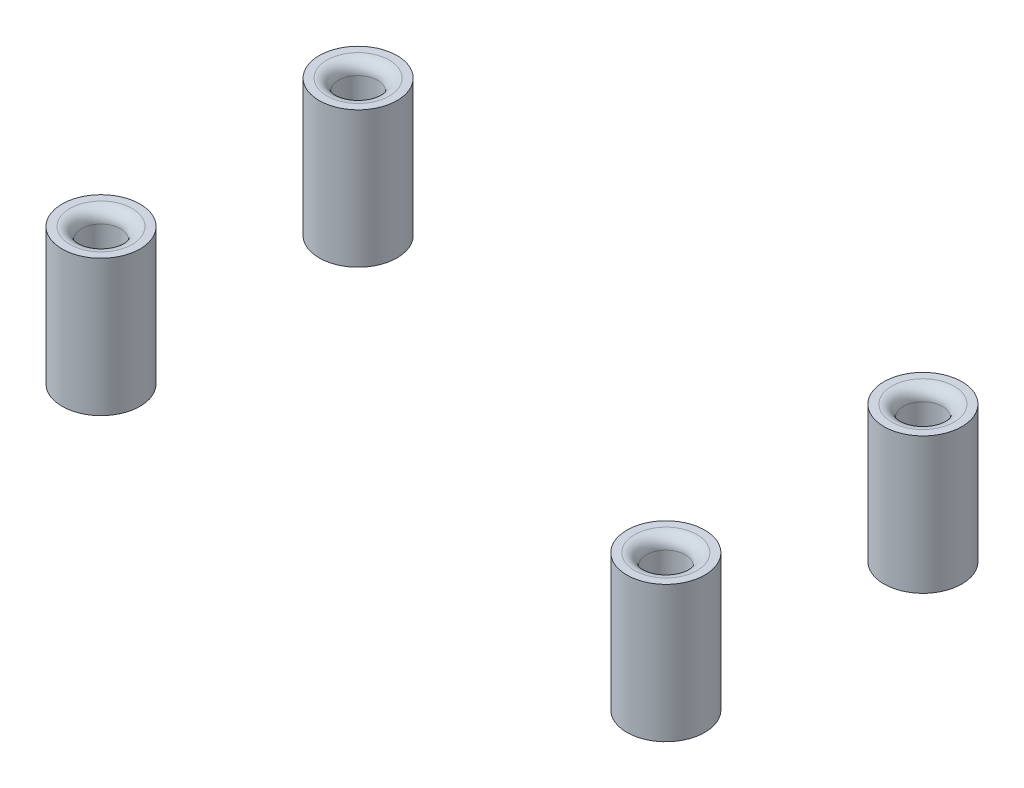
ISO-10303-21;
HEADER;
FILE_DESCRIPTION(('STEP AP214'),'2;1');
FILE_NAME('part.step','',(''),(''),'','','');
FILE_SCHEMA(('AUTOMOTIVE_DESIGN { 1 0 10303 214 1 1 1 1 }'));
ENDSEC;
DATA;
#1=APPLICATION_CONTEXT('core data for automotive mechanical design processes');
#2=APPLICATION_PROTOCOL_DEFINITION('international standard','automotive_design',2000,#1);
#3=PRODUCT_CONTEXT('',#1,'mechanical');
#4=PRODUCT('Part','Part','',(#3));
#5=PRODUCT_RELATED_PRODUCT_CATEGORY('part','',(#4));
#6=PRODUCT_DEFINITION_FORMATION('','',#4);
#7=PRODUCT_DEFINITION_CONTEXT('part definition',#1,'design');
#8=PRODUCT_DEFINITION('design','',#6,#7);
#9=PRODUCT_DEFINITION_SHAPE('','',#8);
#10=(LENGTH_UNIT() NAMED_UNIT(*) SI_UNIT(.MILLI.,.METRE.));
#11=(NAMED_UNIT(*) PLANE_ANGLE_UNIT() SI_UNIT($,.RADIAN.));
#12=(NAMED_UNIT(*) SI_UNIT($,.STERADIAN.) SOLID_ANGLE_UNIT());
#13=UNCERTAINTY_MEASURE_WITH_UNIT(LENGTH_MEASURE(1.E-05),#10,'distance_accuracy_value','');
#14=(GEOMETRIC_REPRESENTATION_CONTEXT(3) GLOBAL_UNCERTAINTY_ASSIGNED_CONTEXT((#13)) GLOBAL_UNIT_ASSIGNED_CONTEXT((#10,
#11,#12)) REPRESENTATION_CONTEXT('',''));
#15=CARTESIAN_POINT('',(0.,0.,0.));
#16=DIRECTION('',(0.,0.,1.));
#17=DIRECTION('',(1.,0.,0.));
#18=AXIS2_PLACEMENT_3D('',#15,#16,#17);
#19=CARTESIAN_POINT('',(72.5,35.,-33.));
#20=DIRECTION('',(0.,-1.,0.));
#21=DIRECTION('',(0.,0.,-1.));
#22=AXIS2_PLACEMENT_3D('',#19,#20,#21);
#23=CYLINDRICAL_SURFACE('',#22,5.00000000000001);
#24=CARTESIAN_POINT('',(72.5,32.,-33.));
#25=DIRECTION('',(0.,1.,0.));
#26=DIRECTION('',(0.,0.,1.));
#27=AXIS2_PLACEMENT_3D('',#24,#25,#26);
#28=CIRCLE('',#27,5.00000000000001);
#29=CARTESIAN_POINT('',(72.5,32.,-28.));
#30=VERTEX_POINT('',#29);
#31=EDGE_CURVE('E55',#30,#30,#28,.T.);
#32=ORIENTED_EDGE('',*,*,#31,.T.);
#33=EDGE_LOOP('',(#32));
#34=FACE_BOUND('',#33,.T.);
#35=CARTESIAN_POINT('',(72.5,0.,-33.));
#36=DIRECTION('',(0.,1.,0.));
#37=DIRECTION('',(0.,0.,1.));
#38=AXIS2_PLACEMENT_3D('',#35,#36,#37);
#39=CIRCLE('',#38,5.00000000000001);
#40=CARTESIAN_POINT('',(72.5,0.,-28.));
#41=VERTEX_POINT('',#40);
#42=EDGE_CURVE('E68',#41,#41,#39,.T.);
#43=ORIENTED_EDGE('',*,*,#42,.F.);
#44=EDGE_LOOP('',(#43));
#45=FACE_BOUND('',#44,.T.);
#46=ADVANCED_FACE('F48',(#34,#45),#23,.F.);
#47=CARTESIAN_POINT('',(72.5,35.,-33.));
#48=DIRECTION('',(0.,-1.,0.));
#49=DIRECTION('',(0.,0.,-1.));
#50=AXIS2_PLACEMENT_3D('',#47,#48,#49);
#51=CYLINDRICAL_SURFACE('',#50,10.);
#52=CARTESIAN_POINT('',(72.5,35.,-33.));
#53=DIRECTION('',(0.,1.,0.));
#54=DIRECTION('',(0.,0.,1.));
#55=AXIS2_PLACEMENT_3D('',#52,#53,#54);
#56=CIRCLE('',#55,10.);
#57=CARTESIAN_POINT('',(72.5,35.,-23.));
#58=VERTEX_POINT('',#57);
#59=EDGE_CURVE('E59',#58,#58,#56,.T.);
#60=ORIENTED_EDGE('',*,*,#59,.F.);
#61=EDGE_LOOP('',(#60));
#62=FACE_BOUND('',#61,.T.);
#63=CARTESIAN_POINT('',(72.5,0.,-33.));
#64=DIRECTION('',(0.,1.,0.));
#65=DIRECTION('',(0.,0.,1.));
#66=AXIS2_PLACEMENT_3D('',#63,#64,#65);
#67=CIRCLE('',#66,10.);
#68=CARTESIAN_POINT('',(72.5,0.,-23.));
#69=VERTEX_POINT('',#68);
#70=EDGE_CURVE('E63',#69,#69,#67,.T.);
#71=ORIENTED_EDGE('',*,*,#70,.T.);
#72=EDGE_LOOP('',(#71));
#73=FACE_BOUND('',#72,.T.);
#74=ADVANCED_FACE('F76',(#62,#73),#51,.T.);
#75=CARTESIAN_POINT('',(0.,35.,0.));
#76=DIRECTION('',(0.,1.,0.));
#77=DIRECTION('',(0.,0.,1.));
#78=AXIS2_PLACEMENT_3D('',#75,#76,#77);
#79=PLANE('',#78);
#80=CARTESIAN_POINT('',(72.5,35.,-33.));
#81=DIRECTION('',(0.,1.,0.));
#82=DIRECTION('',(0.,0.,1.));
#83=AXIS2_PLACEMENT_3D('',#80,#81,#82);
#84=CIRCLE('',#83,8.00000000000001);
#85=CARTESIAN_POINT('',(72.5,35.,-25.));
#86=VERTEX_POINT('',#85);
#87=EDGE_CURVE('E11',#86,#86,#84,.F.);
#88=ORIENTED_EDGE('',*,*,#87,.T.);
#89=EDGE_LOOP('',(#88));
#90=FACE_BOUND('',#89,.T.);
#91=ORIENTED_EDGE('',*,*,#59,.T.);
#92=EDGE_LOOP('',(#91));
#93=FACE_BOUND('',#92,.T.);
#94=ADVANCED_FACE('F80',(#90,#93),#79,.T.);
#95=CARTESIAN_POINT('',(0.,0.,0.));
#96=DIRECTION('',(0.,1.,0.));
#97=DIRECTION('',(0.,0.,1.));
#98=AXIS2_PLACEMENT_3D('',#95,#96,#97);
#99=PLANE('',#98);
#100=ORIENTED_EDGE('',*,*,#42,.T.);
#101=EDGE_LOOP('',(#100));
#102=FACE_BOUND('',#101,.T.);
#103=ORIENTED_EDGE('',*,*,#70,.F.);
#104=EDGE_LOOP('',(#103));
#105=FACE_BOUND('',#104,.T.);
#106=ADVANCED_FACE('F72',(#102,#105),#99,.F.);
#107=CARTESIAN_POINT('',(72.5,32.,-33.));
#108=DIRECTION('',(0.,1.,0.));
#109=DIRECTION('',(0.,0.,1.));
#110=AXIS2_PLACEMENT_3D('',#107,#108,#109);
#111=TOROIDAL_SURFACE('',#110,8.00000000000001,3.);
#112=ORIENTED_EDGE('',*,*,#87,.F.);
#113=EDGE_LOOP('',(#112));
#114=FACE_BOUND('',#113,.T.);
#115=ORIENTED_EDGE('',*,*,#31,.F.);
#116=EDGE_LOOP('',(#115));
#117=FACE_BOUND('',#116,.T.);
#118=ADVANCED_FACE('F50',(#114,#117),#111,.T.);
#119=CLOSED_SHELL('',(#46,#74,#94,#106,#118));
#120=MANIFOLD_SOLID_BREP('B2',#119);
#121=CARTESIAN_POINT('',(72.5,35.,33.));
#122=DIRECTION('',(0.,-1.,0.));
#123=DIRECTION('',(0.,0.,-1.));
#124=AXIS2_PLACEMENT_3D('',#121,#122,#123);
#125=CYLINDRICAL_SURFACE('',#124,5.00000000000001);
#126=CARTESIAN_POINT('',(72.5,32.,33.));
#127=DIRECTION('',(0.,1.,0.));
#128=DIRECTION('',(0.,0.,1.));
#129=AXIS2_PLACEMENT_3D('',#126,#127,#128);
#130=CIRCLE('',#129,5.00000000000001);
#131=CARTESIAN_POINT('',(72.5,32.,38.));
#132=VERTEX_POINT('',#131);
#133=EDGE_CURVE('E140',#132,#132,#130,.T.);
#134=ORIENTED_EDGE('',*,*,#133,.T.);
#135=EDGE_LOOP('',(#134));
#136=FACE_BOUND('',#135,.T.);
#137=CARTESIAN_POINT('',(72.5,0.,33.));
#138=DIRECTION('',(0.,1.,0.));
#139=DIRECTION('',(0.,0.,1.));
#140=AXIS2_PLACEMENT_3D('',#137,#138,#139);
#141=CIRCLE('',#140,5.00000000000001);
#142=CARTESIAN_POINT('',(72.5,0.,38.));
#143=VERTEX_POINT('',#142);
#144=EDGE_CURVE('E153',#143,#143,#141,.T.);
#145=ORIENTED_EDGE('',*,*,#144,.F.);
#146=EDGE_LOOP('',(#145));
#147=FACE_BOUND('',#146,.T.);
#148=ADVANCED_FACE('F133',(#136,#147),#125,.F.);
#149=CARTESIAN_POINT('',(72.5,35.,33.));
#150=DIRECTION('',(0.,-1.,0.));
#151=DIRECTION('',(0.,0.,-1.));
#152=AXIS2_PLACEMENT_3D('',#149,#150,#151);
#153=CYLINDRICAL_SURFACE('',#152,9.99999999999999);
#154=CARTESIAN_POINT('',(72.5,35.,33.));
#155=DIRECTION('',(0.,1.,0.));
#156=DIRECTION('',(0.,0.,1.));
#157=AXIS2_PLACEMENT_3D('',#154,#155,#156);
#158=CIRCLE('',#157,9.99999999999999);
#159=CARTESIAN_POINT('',(72.5,35.,43.));
#160=VERTEX_POINT('',#159);
#161=EDGE_CURVE('E144',#160,#160,#158,.T.);
#162=ORIENTED_EDGE('',*,*,#161,.F.);
#163=EDGE_LOOP('',(#162));
#164=FACE_BOUND('',#163,.T.);
#165=CARTESIAN_POINT('',(72.5,0.,33.));
#166=DIRECTION('',(0.,1.,0.));
#167=DIRECTION('',(0.,0.,1.));
#168=AXIS2_PLACEMENT_3D('',#165,#166,#167);
#169=CIRCLE('',#168,9.99999999999999);
#170=CARTESIAN_POINT('',(72.5,0.,43.));
#171=VERTEX_POINT('',#170);
#172=EDGE_CURVE('E148',#171,#171,#169,.T.);
#173=ORIENTED_EDGE('',*,*,#172,.T.);
#174=EDGE_LOOP('',(#173));
#175=FACE_BOUND('',#174,.T.);
#176=ADVANCED_FACE('F161',(#164,#175),#153,.T.);
#177=CARTESIAN_POINT('',(0.,35.,0.));
#178=DIRECTION('',(0.,1.,0.));
#179=DIRECTION('',(0.,0.,1.));
#180=AXIS2_PLACEMENT_3D('',#177,#178,#179);
#181=PLANE('',#180);
#182=CARTESIAN_POINT('',(72.5,35.,33.));
#183=DIRECTION('',(0.,1.,0.));
#184=DIRECTION('',(0.,0.,1.));
#185=AXIS2_PLACEMENT_3D('',#182,#183,#184);
#186=CIRCLE('',#185,8.00000000000001);
#187=CARTESIAN_POINT('',(72.5,35.,41.));
#188=VERTEX_POINT('',#187);
#189=EDGE_CURVE('E47',#188,#188,#186,.F.);
#190=ORIENTED_EDGE('',*,*,#189,.T.);
#191=EDGE_LOOP('',(#190));
#192=FACE_BOUND('',#191,.T.);
#193=ORIENTED_EDGE('',*,*,#161,.T.);
#194=EDGE_LOOP('',(#193));
#195=FACE_BOUND('',#194,.T.);
#196=ADVANCED_FACE('F165',(#192,#195),#181,.T.);
#197=CARTESIAN_POINT('',(0.,0.,0.));
#198=DIRECTION('',(0.,1.,0.));
#199=DIRECTION('',(0.,0.,1.));
#200=AXIS2_PLACEMENT_3D('',#197,#198,#199);
#201=PLANE('',#200);
#202=ORIENTED_EDGE('',*,*,#144,.T.);
#203=EDGE_LOOP('',(#202));
#204=FACE_BOUND('',#203,.T.);
#205=ORIENTED_EDGE('',*,*,#172,.F.);
#206=EDGE_LOOP('',(#205));
#207=FACE_BOUND('',#206,.T.);
#208=ADVANCED_FACE('F157',(#204,#207),#201,.F.);
#209=CARTESIAN_POINT('',(72.5,32.,33.));
#210=DIRECTION('',(0.,1.,0.));
#211=DIRECTION('',(0.,0.,1.));
#212=AXIS2_PLACEMENT_3D('',#209,#210,#211);
#213=TOROIDAL_SURFACE('',#212,8.00000000000001,3.);
#214=ORIENTED_EDGE('',*,*,#189,.F.);
#215=EDGE_LOOP('',(#214));
#216=FACE_BOUND('',#215,.T.);
#217=ORIENTED_EDGE('',*,*,#133,.F.);
#218=EDGE_LOOP('',(#217));
#219=FACE_BOUND('',#218,.T.);
#220=ADVANCED_FACE('F135',(#216,#219),#213,.T.);
#221=CLOSED_SHELL('',(#148,#176,#196,#208,#220));
#222=MANIFOLD_SOLID_BREP('B6',#221);
#223=CARTESIAN_POINT('',(-72.5,35.,-33.));
#224=DIRECTION('',(0.,-1.,0.));
#225=DIRECTION('',(0.,0.,-1.));
#226=AXIS2_PLACEMENT_3D('',#223,#224,#225);
#227=CYLINDRICAL_SURFACE('',#226,4.99999999999999);
#228=CARTESIAN_POINT('',(-72.5,32.,-33.));
#229=DIRECTION('',(0.,1.,0.));
#230=DIRECTION('',(0.,0.,1.));
#231=AXIS2_PLACEMENT_3D('',#228,#229,#230);
#232=CIRCLE('',#231,4.99999999999999);
#233=CARTESIAN_POINT('',(-72.5,32.,-28.));
#234=VERTEX_POINT('',#233);
#235=EDGE_CURVE('E225',#234,#234,#232,.T.);
#236=ORIENTED_EDGE('',*,*,#235,.T.);
#237=EDGE_LOOP('',(#236));
#238=FACE_BOUND('',#237,.T.);
#239=CARTESIAN_POINT('',(-72.5,0.,-33.));
#240=DIRECTION('',(0.,1.,0.));
#241=DIRECTION('',(0.,0.,1.));
#242=AXIS2_PLACEMENT_3D('',#239,#240,#241);
#243=CIRCLE('',#242,4.99999999999999);
#244=CARTESIAN_POINT('',(-72.5,0.,-28.));
#245=VERTEX_POINT('',#244);
#246=EDGE_CURVE('E241',#245,#245,#243,.T.);
#247=ORIENTED_EDGE('',*,*,#246,.F.);
#248=EDGE_LOOP('',(#247));
#249=FACE_BOUND('',#248,.T.);
#250=ADVANCED_FACE('F217',(#238,#249),#227,.F.);
#251=CARTESIAN_POINT('',(-72.5,35.,-33.));
#252=DIRECTION('',(0.,-1.,0.));
#253=DIRECTION('',(0.,0.,-1.));
#254=AXIS2_PLACEMENT_3D('',#251,#252,#253);
#255=CYLINDRICAL_SURFACE('',#254,10.);
#256=CARTESIAN_POINT('',(-72.5,35.,-33.));
#257=DIRECTION('',(0.,1.,0.));
#258=DIRECTION('',(0.,0.,1.));
#259=AXIS2_PLACEMENT_3D('',#256,#257,#258);
#260=CIRCLE('',#259,10.);
#261=CARTESIAN_POINT('',(-72.5,35.,-23.));
#262=VERTEX_POINT('',#261);
#263=EDGE_CURVE('E230',#262,#262,#260,.T.);
#264=ORIENTED_EDGE('',*,*,#263,.F.);
#265=EDGE_LOOP('',(#264));
#266=FACE_BOUND('',#265,.T.);
#267=CARTESIAN_POINT('',(-72.5,0.,-33.));
#268=DIRECTION('',(0.,1.,0.));
#269=DIRECTION('',(0.,0.,1.));
#270=AXIS2_PLACEMENT_3D('',#267,#268,#269);
#271=CIRCLE('',#270,10.);
#272=CARTESIAN_POINT('',(-72.5,0.,-23.));
#273=VERTEX_POINT('',#272);
#274=EDGE_CURVE('E235',#273,#273,#271,.T.);
#275=ORIENTED_EDGE('',*,*,#274,.T.);
#276=EDGE_LOOP('',(#275));
#277=FACE_BOUND('',#276,.T.);
#278=ADVANCED_FACE('F250',(#266,#277),#255,.T.);
#279=CARTESIAN_POINT('',(0.,35.,0.));
#280=DIRECTION('',(0.,1.,0.));
#281=DIRECTION('',(0.,0.,1.));
#282=AXIS2_PLACEMENT_3D('',#279,#280,#281);
#283=PLANE('',#282);
#284=CARTESIAN_POINT('',(-72.5,35.,-33.));
#285=DIRECTION('',(0.,1.,0.));
#286=DIRECTION('',(0.,0.,1.));
#287=AXIS2_PLACEMENT_3D('',#284,#285,#286);
#288=CIRCLE('',#287,7.99999999999999);
#289=CARTESIAN_POINT('',(-72.5,35.,-25.));
#290=VERTEX_POINT('',#289);
#291=EDGE_CURVE('E132',#290,#290,#288,.F.);
#292=ORIENTED_EDGE('',*,*,#291,.T.);
#293=EDGE_LOOP('',(#292));
#294=FACE_BOUND('',#293,.T.);
#295=ORIENTED_EDGE('',*,*,#263,.T.);
#296=EDGE_LOOP('',(#295));
#297=FACE_BOUND('',#296,.T.);
#298=ADVANCED_FACE('F254',(#294,#297),#283,.T.);
#299=CARTESIAN_POINT('',(0.,0.,0.));
#300=DIRECTION('',(0.,1.,0.));
#301=DIRECTION('',(0.,0.,1.));
#302=AXIS2_PLACEMENT_3D('',#299,#300,#301);
#303=PLANE('',#302);
#304=ORIENTED_EDGE('',*,*,#246,.T.);
#305=EDGE_LOOP('',(#304));
#306=FACE_BOUND('',#305,.T.);
#307=ORIENTED_EDGE('',*,*,#274,.F.);
#308=EDGE_LOOP('',(#307));
#309=FACE_BOUND('',#308,.T.);
#310=ADVANCED_FACE('F246',(#306,#309),#303,.F.);
#311=CARTESIAN_POINT('',(-72.5,32.,-33.));
#312=DIRECTION('',(0.,1.,0.));
#313=DIRECTION('',(0.,0.,1.));
#314=AXIS2_PLACEMENT_3D('',#311,#312,#313);
#315=TOROIDAL_SURFACE('',#314,7.99999999999999,3.);
#316=ORIENTED_EDGE('',*,*,#291,.F.);
#317=EDGE_LOOP('',(#316));
#318=FACE_BOUND('',#317,.T.);
#319=ORIENTED_EDGE('',*,*,#235,.F.);
#320=EDGE_LOOP('',(#319));
#321=FACE_BOUND('',#320,.T.);
#322=ADVANCED_FACE('F219',(#318,#321),#315,.T.);
#323=CLOSED_SHELL('',(#250,#278,#298,#310,#322));
#324=MANIFOLD_SOLID_BREP('B42',#323);
#325=CARTESIAN_POINT('',(-72.5,35.,33.));
#326=DIRECTION('',(0.,-1.,0.));
#327=DIRECTION('',(0.,0.,-1.));
#328=AXIS2_PLACEMENT_3D('',#325,#326,#327);
#329=CYLINDRICAL_SURFACE('',#328,4.99999999999999);
#330=CARTESIAN_POINT('',(-72.5,32.,33.));
#331=DIRECTION('',(0.,1.,0.));
#332=DIRECTION('',(0.,0.,1.));
#333=AXIS2_PLACEMENT_3D('',#330,#331,#332);
#334=CIRCLE('',#333,4.99999999999999);
#335=CARTESIAN_POINT('',(-72.5,32.,38.));
#336=VERTEX_POINT('',#335);
#337=EDGE_CURVE('E306',#336,#336,#334,.T.);
#338=ORIENTED_EDGE('',*,*,#337,.T.);
#339=EDGE_LOOP('',(#338));
#340=FACE_BOUND('',#339,.T.);
#341=CARTESIAN_POINT('',(-72.5,0.,33.));
#342=DIRECTION('',(0.,1.,0.));
#343=DIRECTION('',(0.,0.,1.));
#344=AXIS2_PLACEMENT_3D('',#341,#342,#343);
#345=CIRCLE('',#344,4.99999999999999);
#346=CARTESIAN_POINT('',(-72.5,0.,38.));
#347=VERTEX_POINT('',#346);
#348=EDGE_CURVE('E319',#347,#347,#345,.T.);
#349=ORIENTED_EDGE('',*,*,#348,.F.);
#350=EDGE_LOOP('',(#349));
#351=FACE_BOUND('',#350,.T.);
#352=ADVANCED_FACE('F299',(#340,#351),#329,.F.);
#353=CARTESIAN_POINT('',(-72.5,35.,33.));
#354=DIRECTION('',(0.,-1.,0.));
#355=DIRECTION('',(0.,0.,-1.));
#356=AXIS2_PLACEMENT_3D('',#353,#354,#355);
#357=CYLINDRICAL_SURFACE('',#356,10.);
#358=CARTESIAN_POINT('',(-72.5,35.,33.));
#359=DIRECTION('',(0.,1.,0.));
#360=DIRECTION('',(0.,0.,1.));
#361=AXIS2_PLACEMENT_3D('',#358,#359,#360);
#362=CIRCLE('',#361,10.);
#363=CARTESIAN_POINT('',(-72.5,35.,43.));
#364=VERTEX_POINT('',#363);
#365=EDGE_CURVE('E310',#364,#364,#362,.T.);
#366=ORIENTED_EDGE('',*,*,#365,.F.);
#367=EDGE_LOOP('',(#366));
#368=FACE_BOUND('',#367,.T.);
#369=CARTESIAN_POINT('',(-72.5,0.,33.));
#370=DIRECTION('',(0.,1.,0.));
#371=DIRECTION('',(0.,0.,1.));
#372=AXIS2_PLACEMENT_3D('',#369,#370,#371);
#373=CIRCLE('',#372,10.);
#374=CARTESIAN_POINT('',(-72.5,0.,43.));
#375=VERTEX_POINT('',#374);
#376=EDGE_CURVE('E314',#375,#375,#373,.T.);
#377=ORIENTED_EDGE('',*,*,#376,.T.);
#378=EDGE_LOOP('',(#377));
#379=FACE_BOUND('',#378,.T.);
#380=ADVANCED_FACE('F327',(#368,#379),#357,.T.);
#381=CARTESIAN_POINT('',(0.,35.,0.));
#382=DIRECTION('',(0.,1.,0.));
#383=DIRECTION('',(0.,0.,1.));
#384=AXIS2_PLACEMENT_3D('',#381,#382,#383);
#385=PLANE('',#384);
#386=CARTESIAN_POINT('',(-72.5,35.,33.));
#387=DIRECTION('',(0.,1.,0.));
#388=DIRECTION('',(0.,0.,1.));
#389=AXIS2_PLACEMENT_3D('',#386,#387,#388);
#390=CIRCLE('',#389,7.99999999999999);
#391=CARTESIAN_POINT('',(-72.5,35.,41.));
#392=VERTEX_POINT('',#391);
#393=EDGE_CURVE('E216',#392,#392,#390,.F.);
#394=ORIENTED_EDGE('',*,*,#393,.T.);
#395=EDGE_LOOP('',(#394));
#396=FACE_BOUND('',#395,.T.);
#397=ORIENTED_EDGE('',*,*,#365,.T.);
#398=EDGE_LOOP('',(#397));
#399=FACE_BOUND('',#398,.T.);
#400=ADVANCED_FACE('F331',(#396,#399),#385,.T.);
#401=CARTESIAN_POINT('',(0.,0.,0.));
#402=DIRECTION('',(0.,1.,0.));
#403=DIRECTION('',(0.,0.,1.));
#404=AXIS2_PLACEMENT_3D('',#401,#402,#403);
#405=PLANE('',#404);
#406=ORIENTED_EDGE('',*,*,#348,.T.);
#407=EDGE_LOOP('',(#406));
#408=FACE_BOUND('',#407,.T.);
#409=ORIENTED_EDGE('',*,*,#376,.F.);
#410=EDGE_LOOP('',(#409));
#411=FACE_BOUND('',#410,.T.);
#412=ADVANCED_FACE('F323',(#408,#411),#405,.F.);
#413=CARTESIAN_POINT('',(-72.5,32.,33.));
#414=DIRECTION('',(0.,1.,0.));
#415=DIRECTION('',(0.,0.,1.));
#416=AXIS2_PLACEMENT_3D('',#413,#414,#415);
#417=TOROIDAL_SURFACE('',#416,7.99999999999999,3.);
#418=ORIENTED_EDGE('',*,*,#393,.F.);
#419=EDGE_LOOP('',(#418));
#420=FACE_BOUND('',#419,.T.);
#421=ORIENTED_EDGE('',*,*,#337,.F.);
#422=EDGE_LOOP('',(#421));
#423=FACE_BOUND('',#422,.T.);
#424=ADVANCED_FACE('F301',(#420,#423),#417,.T.);
#425=CLOSED_SHELL('',(#352,#380,#400,#412,#424));
#426=MANIFOLD_SOLID_BREP('B127',#425);
#427=ADVANCED_BREP_SHAPE_REPRESENTATION('',(#18,#120,#222,#324,#426),#14);
#428=SHAPE_DEFINITION_REPRESENTATION(#9,#427);
ENDSEC;
END-ISO-10303-21;
